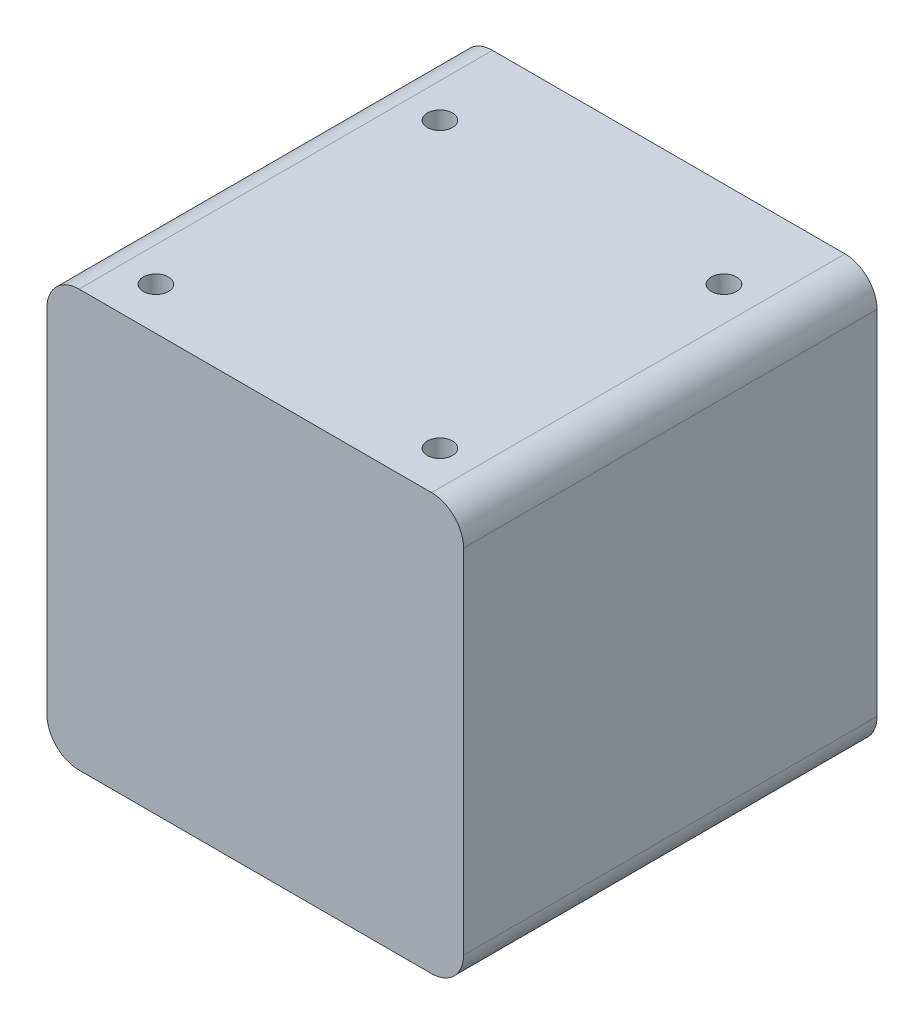
ISO-10303-21;
HEADER;
FILE_DESCRIPTION(('STEP AP214'),'2;1');
FILE_NAME('part.step','',(''),(''),'','','');
FILE_SCHEMA(('AUTOMOTIVE_DESIGN { 1 0 10303 214 1 1 1 1 }'));
ENDSEC;
DATA;
#1=APPLICATION_CONTEXT('core data for automotive mechanical design processes');
#2=APPLICATION_PROTOCOL_DEFINITION('international standard','automotive_design',2000,#1);
#3=PRODUCT_CONTEXT('',#1,'mechanical');
#4=PRODUCT('Part','Part','',(#3));
#5=PRODUCT_RELATED_PRODUCT_CATEGORY('part','',(#4));
#6=PRODUCT_DEFINITION_FORMATION('','',#4);
#7=PRODUCT_DEFINITION_CONTEXT('part definition',#1,'design');
#8=PRODUCT_DEFINITION('design','',#6,#7);
#9=PRODUCT_DEFINITION_SHAPE('','',#8);
#10=(LENGTH_UNIT() NAMED_UNIT(*) SI_UNIT(.MILLI.,.METRE.));
#11=(NAMED_UNIT(*) PLANE_ANGLE_UNIT() SI_UNIT($,.RADIAN.));
#12=(NAMED_UNIT(*) SI_UNIT($,.STERADIAN.) SOLID_ANGLE_UNIT());
#13=UNCERTAINTY_MEASURE_WITH_UNIT(LENGTH_MEASURE(1.E-05),#10,'distance_accuracy_value','');
#14=(GEOMETRIC_REPRESENTATION_CONTEXT(3) GLOBAL_UNCERTAINTY_ASSIGNED_CONTEXT((#13)) GLOBAL_UNIT_ASSIGNED_CONTEXT((#10,
#11,#12)) REPRESENTATION_CONTEXT('',''));
#15=CARTESIAN_POINT('',(0.,0.,0.));
#16=DIRECTION('',(0.,0.,1.));
#17=DIRECTION('',(1.,0.,0.));
#18=AXIS2_PLACEMENT_3D('',#15,#16,#17);
#19=CARTESIAN_POINT('',(-13.2,13.2,26.2));
#20=DIRECTION('',(1.,0.,0.));
#21=DIRECTION('',(0.,1.,0.));
#22=AXIS2_PLACEMENT_3D('',#19,#20,#21);
#23=PLANE('',#22);
#24=DIRECTION('',(0.,-1.,0.));
#25=VECTOR('',#24,1.);
#26=CARTESIAN_POINT('',(-13.2,13.2,0.));
#27=LINE('',#26,#25);
#28=CARTESIAN_POINT('',(-13.2,11.168,0.));
#29=VERTEX_POINT('',#28);
#30=CARTESIAN_POINT('',(-13.2,-11.168,0.));
#31=VERTEX_POINT('',#30);
#32=EDGE_CURVE('E131',#29,#31,#27,.T.);
#33=ORIENTED_EDGE('',*,*,#32,.T.);
#34=DIRECTION('',(0.,0.,-1.));
#35=VECTOR('',#34,1.);
#36=CARTESIAN_POINT('',(-13.2,-11.168,26.2));
#37=LINE('',#36,#35);
#38=CARTESIAN_POINT('',(-13.2,-11.168,26.2));
#39=VERTEX_POINT('',#38);
#40=EDGE_CURVE('E154',#31,#39,#37,.F.);
#41=ORIENTED_EDGE('',*,*,#40,.T.);
#42=DIRECTION('',(0.,-1.,0.));
#43=VECTOR('',#42,1.);
#44=CARTESIAN_POINT('',(-13.2,13.2,26.2));
#45=LINE('',#44,#43);
#46=CARTESIAN_POINT('',(-13.2,11.168,26.2));
#47=VERTEX_POINT('',#46);
#48=EDGE_CURVE('E129',#47,#39,#45,.T.);
#49=ORIENTED_EDGE('',*,*,#48,.F.);
#50=DIRECTION('',(0.,0.,-1.));
#51=VECTOR('',#50,1.);
#52=CARTESIAN_POINT('',(-13.2,11.168,26.2));
#53=LINE('',#52,#51);
#54=EDGE_CURVE('E151',#47,#29,#53,.T.);
#55=ORIENTED_EDGE('',*,*,#54,.T.);
#56=EDGE_LOOP('',(#33,#41,#49,#55));
#57=FACE_BOUND('',#56,.T.);
#58=ADVANCED_FACE('F36',(#57),#23,.F.);
#59=CARTESIAN_POINT('',(13.2,-13.2,26.2));
#60=DIRECTION('',(0.,1.,0.));
#61=DIRECTION('',(-1.,0.,0.));
#62=AXIS2_PLACEMENT_3D('',#59,#60,#61);
#63=PLANE('',#62);
#64=CARTESIAN_POINT('',(-9.,-13.2,23.5));
#65=DIRECTION('',(0.,-1.,0.));
#66=DIRECTION('',(0.,0.,-1.));
#67=AXIS2_PLACEMENT_3D('',#64,#65,#66);
#68=CIRCLE('',#67,0.799999999999999);
#69=CARTESIAN_POINT('',(-9.,-13.2,22.7));
#70=VERTEX_POINT('',#69);
#71=EDGE_CURVE('E206',#70,#70,#68,.T.);
#72=ORIENTED_EDGE('',*,*,#71,.F.);
#73=EDGE_LOOP('',(#72));
#74=FACE_BOUND('',#73,.T.);
#75=CARTESIAN_POINT('',(-9.,-13.2,5.5));
#76=DIRECTION('',(0.,-1.,0.));
#77=DIRECTION('',(0.,0.,-1.));
#78=AXIS2_PLACEMENT_3D('',#75,#76,#77);
#79=CIRCLE('',#78,0.799999999999999);
#80=CARTESIAN_POINT('',(-9.,-13.2,4.7));
#81=VERTEX_POINT('',#80);
#82=EDGE_CURVE('E200',#81,#81,#79,.T.);
#83=ORIENTED_EDGE('',*,*,#82,.F.);
#84=EDGE_LOOP('',(#83));
#85=FACE_BOUND('',#84,.T.);
#86=CARTESIAN_POINT('',(9.00000000000001,-13.2,5.5));
#87=DIRECTION('',(0.,-1.,0.));
#88=DIRECTION('',(0.,0.,-1.));
#89=AXIS2_PLACEMENT_3D('',#86,#87,#88);
#90=CIRCLE('',#89,0.799999999999999);
#91=CARTESIAN_POINT('',(9.00000000000001,-13.2,4.7));
#92=VERTEX_POINT('',#91);
#93=EDGE_CURVE('E194',#92,#92,#90,.T.);
#94=ORIENTED_EDGE('',*,*,#93,.F.);
#95=EDGE_LOOP('',(#94));
#96=FACE_BOUND('',#95,.T.);
#97=CARTESIAN_POINT('',(9.,-13.2,23.5));
#98=DIRECTION('',(0.,-1.,0.));
#99=DIRECTION('',(0.,0.,-1.));
#100=AXIS2_PLACEMENT_3D('',#97,#98,#99);
#101=CIRCLE('',#100,0.799999999999999);
#102=CARTESIAN_POINT('',(9.,-13.2,22.7));
#103=VERTEX_POINT('',#102);
#104=EDGE_CURVE('E188',#103,#103,#101,.T.);
#105=ORIENTED_EDGE('',*,*,#104,.F.);
#106=EDGE_LOOP('',(#105));
#107=FACE_BOUND('',#106,.T.);
#108=DIRECTION('',(1.,0.,0.));
#109=VECTOR('',#108,1.);
#110=CARTESIAN_POINT('',(13.2,-13.2,0.));
#111=LINE('',#110,#109);
#112=CARTESIAN_POINT('',(-11.168,-13.2,0.));
#113=VERTEX_POINT('',#112);
#114=CARTESIAN_POINT('',(11.168,-13.2,0.));
#115=VERTEX_POINT('',#114);
#116=EDGE_CURVE('E127',#113,#115,#111,.T.);
#117=ORIENTED_EDGE('',*,*,#116,.T.);
#118=DIRECTION('',(0.,0.,-1.));
#119=VECTOR('',#118,1.);
#120=CARTESIAN_POINT('',(11.168,-13.2,26.2));
#121=LINE('',#120,#119);
#122=CARTESIAN_POINT('',(11.168,-13.2,26.2));
#123=VERTEX_POINT('',#122);
#124=EDGE_CURVE('E106',#115,#123,#121,.F.);
#125=ORIENTED_EDGE('',*,*,#124,.T.);
#126=DIRECTION('',(1.,0.,0.));
#127=VECTOR('',#126,1.);
#128=CARTESIAN_POINT('',(13.2,-13.2,26.2));
#129=LINE('',#128,#127);
#130=CARTESIAN_POINT('',(-11.168,-13.2,26.2));
#131=VERTEX_POINT('',#130);
#132=EDGE_CURVE('E170',#131,#123,#129,.T.);
#133=ORIENTED_EDGE('',*,*,#132,.F.);
#134=DIRECTION('',(0.,0.,-1.));
#135=VECTOR('',#134,1.);
#136=CARTESIAN_POINT('',(-11.168,-13.2,26.2));
#137=LINE('',#136,#135);
#138=EDGE_CURVE('E111',#131,#113,#137,.T.);
#139=ORIENTED_EDGE('',*,*,#138,.T.);
#140=EDGE_LOOP('',(#117,#125,#133,#139));
#141=FACE_BOUND('',#140,.T.);
#142=ADVANCED_FACE('F264',(#74,#85,#96,#107,#141),#63,.F.);
#143=CARTESIAN_POINT('',(13.2,13.2,26.2));
#144=DIRECTION('',(-1.,0.,0.));
#145=DIRECTION('',(0.,-1.,0.));
#146=AXIS2_PLACEMENT_3D('',#143,#144,#145);
#147=PLANE('',#146);
#148=DIRECTION('',(0.,1.,0.));
#149=VECTOR('',#148,1.);
#150=CARTESIAN_POINT('',(13.2,13.2,26.2));
#151=LINE('',#150,#149);
#152=CARTESIAN_POINT('',(13.2,-11.168,26.2));
#153=VERTEX_POINT('',#152);
#154=CARTESIAN_POINT('',(13.2,11.168,26.2));
#155=VERTEX_POINT('',#154);
#156=EDGE_CURVE('E120',#153,#155,#151,.T.);
#157=ORIENTED_EDGE('',*,*,#156,.F.);
#158=DIRECTION('',(0.,0.,-1.));
#159=VECTOR('',#158,1.);
#160=CARTESIAN_POINT('',(13.2,-11.168,26.2));
#161=LINE('',#160,#159);
#162=CARTESIAN_POINT('',(13.2,-11.168,0.));
#163=VERTEX_POINT('',#162);
#164=EDGE_CURVE('E105',#153,#163,#161,.T.);
#165=ORIENTED_EDGE('',*,*,#164,.T.);
#166=DIRECTION('',(0.,1.,0.));
#167=VECTOR('',#166,1.);
#168=CARTESIAN_POINT('',(13.2,13.2,0.));
#169=LINE('',#168,#167);
#170=CARTESIAN_POINT('',(13.2,11.168,0.));
#171=VERTEX_POINT('',#170);
#172=EDGE_CURVE('E118',#163,#171,#169,.T.);
#173=ORIENTED_EDGE('',*,*,#172,.T.);
#174=DIRECTION('',(0.,0.,-1.));
#175=VECTOR('',#174,1.);
#176=CARTESIAN_POINT('',(13.2,11.168,26.2));
#177=LINE('',#176,#175);
#178=EDGE_CURVE('E122',#171,#155,#177,.F.);
#179=ORIENTED_EDGE('',*,*,#178,.T.);
#180=EDGE_LOOP('',(#157,#165,#173,#179));
#181=FACE_BOUND('',#180,.T.);
#182=ADVANCED_FACE('F117',(#181),#147,.F.);
#183=CARTESIAN_POINT('',(13.2,13.2,26.2));
#184=DIRECTION('',(0.,-1.,0.));
#185=DIRECTION('',(1.,0.,0.));
#186=AXIS2_PLACEMENT_3D('',#183,#184,#185);
#187=PLANE('',#186);
#188=CARTESIAN_POINT('',(9.,13.2,5.5));
#189=DIRECTION('',(0.,1.,0.));
#190=DIRECTION('',(0.,0.,1.));
#191=AXIS2_PLACEMENT_3D('',#188,#189,#190);
#192=CIRCLE('',#191,0.79999999999999);
#193=CARTESIAN_POINT('',(9.,13.2,6.29999999999999));
#194=VERTEX_POINT('',#193);
#195=EDGE_CURVE('E230',#194,#194,#192,.T.);
#196=ORIENTED_EDGE('',*,*,#195,.F.);
#197=EDGE_LOOP('',(#196));
#198=FACE_BOUND('',#197,.T.);
#199=CARTESIAN_POINT('',(9.,13.2,23.5));
#200=DIRECTION('',(0.,1.,0.));
#201=DIRECTION('',(0.,0.,1.));
#202=AXIS2_PLACEMENT_3D('',#199,#200,#201);
#203=CIRCLE('',#202,0.79999999999999);
#204=CARTESIAN_POINT('',(9.,13.2,24.3));
#205=VERTEX_POINT('',#204);
#206=EDGE_CURVE('E224',#205,#205,#203,.T.);
#207=ORIENTED_EDGE('',*,*,#206,.F.);
#208=EDGE_LOOP('',(#207));
#209=FACE_BOUND('',#208,.T.);
#210=CARTESIAN_POINT('',(-9.,13.2,23.5));
#211=DIRECTION('',(0.,1.,0.));
#212=DIRECTION('',(0.,0.,1.));
#213=AXIS2_PLACEMENT_3D('',#210,#211,#212);
#214=CIRCLE('',#213,0.79999999999999);
#215=CARTESIAN_POINT('',(-9.,13.2,24.3));
#216=VERTEX_POINT('',#215);
#217=EDGE_CURVE('E218',#216,#216,#214,.T.);
#218=ORIENTED_EDGE('',*,*,#217,.F.);
#219=EDGE_LOOP('',(#218));
#220=FACE_BOUND('',#219,.T.);
#221=CARTESIAN_POINT('',(-9.,13.2,5.5));
#222=DIRECTION('',(0.,1.,0.));
#223=DIRECTION('',(0.,0.,1.));
#224=AXIS2_PLACEMENT_3D('',#221,#222,#223);
#225=CIRCLE('',#224,0.79999999999999);
#226=CARTESIAN_POINT('',(-9.,13.2,6.29999999999999));
#227=VERTEX_POINT('',#226);
#228=EDGE_CURVE('E212',#227,#227,#225,.T.);
#229=ORIENTED_EDGE('',*,*,#228,.F.);
#230=EDGE_LOOP('',(#229));
#231=FACE_BOUND('',#230,.T.);
#232=DIRECTION('',(-1.,0.,0.));
#233=VECTOR('',#232,1.);
#234=CARTESIAN_POINT('',(13.2,13.2,0.));
#235=LINE('',#234,#233);
#236=CARTESIAN_POINT('',(11.168,13.2,0.));
#237=VERTEX_POINT('',#236);
#238=CARTESIAN_POINT('',(-11.168,13.2,0.));
#239=VERTEX_POINT('',#238);
#240=EDGE_CURVE('E126',#237,#239,#235,.T.);
#241=ORIENTED_EDGE('',*,*,#240,.T.);
#242=DIRECTION('',(0.,0.,-1.));
#243=VECTOR('',#242,1.);
#244=CARTESIAN_POINT('',(-11.168,13.2,26.2));
#245=LINE('',#244,#243);
#246=CARTESIAN_POINT('',(-11.168,13.2,26.2));
#247=VERTEX_POINT('',#246);
#248=EDGE_CURVE('E11',#239,#247,#245,.F.);
#249=ORIENTED_EDGE('',*,*,#248,.T.);
#250=DIRECTION('',(-1.,0.,0.));
#251=VECTOR('',#250,1.);
#252=CARTESIAN_POINT('',(13.2,13.2,26.2));
#253=LINE('',#252,#251);
#254=CARTESIAN_POINT('',(11.168,13.2,26.2));
#255=VERTEX_POINT('',#254);
#256=EDGE_CURVE('E135',#255,#247,#253,.T.);
#257=ORIENTED_EDGE('',*,*,#256,.F.);
#258=DIRECTION('',(0.,0.,-1.));
#259=VECTOR('',#258,1.);
#260=CARTESIAN_POINT('',(11.168,13.2,26.2));
#261=LINE('',#260,#259);
#262=EDGE_CURVE('E44',#255,#237,#261,.T.);
#263=ORIENTED_EDGE('',*,*,#262,.T.);
#264=EDGE_LOOP('',(#241,#249,#257,#263));
#265=FACE_BOUND('',#264,.T.);
#266=ADVANCED_FACE('F157',(#198,#209,#220,#231,#265),#187,.F.);
#267=CARTESIAN_POINT('',(0.,0.,26.2));
#268=DIRECTION('',(0.,0.,-1.));
#269=DIRECTION('',(-1.,0.,0.));
#270=AXIS2_PLACEMENT_3D('',#267,#268,#269);
#271=PLANE('',#270);
#272=ORIENTED_EDGE('',*,*,#132,.T.);
#273=CARTESIAN_POINT('',(11.168,-11.168,26.2));
#274=DIRECTION('',(0.,0.,-1.));
#275=DIRECTION('',(-1.,0.,0.));
#276=AXIS2_PLACEMENT_3D('',#273,#274,#275);
#277=CIRCLE('',#276,2.032);
#278=EDGE_CURVE('E149',#123,#153,#277,.F.);
#279=ORIENTED_EDGE('',*,*,#278,.T.);
#280=ORIENTED_EDGE('',*,*,#156,.T.);
#281=CARTESIAN_POINT('',(11.168,11.168,26.2));
#282=DIRECTION('',(0.,0.,-1.));
#283=DIRECTION('',(-1.,0.,0.));
#284=AXIS2_PLACEMENT_3D('',#281,#282,#283);
#285=CIRCLE('',#284,2.032);
#286=EDGE_CURVE('E56',#155,#255,#285,.F.);
#287=ORIENTED_EDGE('',*,*,#286,.T.);
#288=ORIENTED_EDGE('',*,*,#256,.T.);
#289=CARTESIAN_POINT('',(-11.168,11.168,26.2));
#290=DIRECTION('',(0.,0.,-1.));
#291=DIRECTION('',(-1.,0.,0.));
#292=AXIS2_PLACEMENT_3D('',#289,#290,#291);
#293=CIRCLE('',#292,2.032);
#294=EDGE_CURVE('E145',#247,#47,#293,.F.);
#295=ORIENTED_EDGE('',*,*,#294,.T.);
#296=ORIENTED_EDGE('',*,*,#48,.T.);
#297=CARTESIAN_POINT('',(-11.168,-11.168,26.2));
#298=DIRECTION('',(0.,0.,-1.));
#299=DIRECTION('',(-1.,0.,0.));
#300=AXIS2_PLACEMENT_3D('',#297,#298,#299);
#301=CIRCLE('',#300,2.032);
#302=EDGE_CURVE('E147',#39,#131,#301,.F.);
#303=ORIENTED_EDGE('',*,*,#302,.T.);
#304=EDGE_LOOP('',(#272,#279,#280,#287,#288,#295,#296,#303));
#305=FACE_BOUND('',#304,.T.);
#306=ADVANCED_FACE('F238',(#305),#271,.F.);
#307=CARTESIAN_POINT('',(0.,0.,0.));
#308=DIRECTION('',(0.,0.,-1.));
#309=DIRECTION('',(-1.,0.,0.));
#310=AXIS2_PLACEMENT_3D('',#307,#308,#309);
#311=PLANE('',#310);
#312=CARTESIAN_POINT('',(0.,0.,0.));
#313=DIRECTION('',(0.,0.,-1.));
#314=DIRECTION('',(-1.,0.,0.));
#315=AXIS2_PLACEMENT_3D('',#312,#313,#314);
#316=CIRCLE('',#315,12.6261921591022);
#317=CARTESIAN_POINT('',(-12.6261921591022,0.,0.));
#318=VERTEX_POINT('',#317);
#319=EDGE_CURVE('E175',#318,#318,#316,.T.);
#320=ORIENTED_EDGE('',*,*,#319,.F.);
#321=EDGE_LOOP('',(#320));
#322=FACE_BOUND('',#321,.T.);
#323=ORIENTED_EDGE('',*,*,#172,.F.);
#324=CARTESIAN_POINT('',(11.168,-11.168,0.));
#325=DIRECTION('',(0.,0.,-1.));
#326=DIRECTION('',(-1.,0.,0.));
#327=AXIS2_PLACEMENT_3D('',#324,#325,#326);
#328=CIRCLE('',#327,2.032);
#329=EDGE_CURVE('E101',#163,#115,#328,.T.);
#330=ORIENTED_EDGE('',*,*,#329,.T.);
#331=ORIENTED_EDGE('',*,*,#116,.F.);
#332=CARTESIAN_POINT('',(-11.168,-11.168,0.));
#333=DIRECTION('',(0.,0.,-1.));
#334=DIRECTION('',(-1.,0.,0.));
#335=AXIS2_PLACEMENT_3D('',#332,#333,#334);
#336=CIRCLE('',#335,2.032);
#337=EDGE_CURVE('E112',#113,#31,#336,.T.);
#338=ORIENTED_EDGE('',*,*,#337,.T.);
#339=ORIENTED_EDGE('',*,*,#32,.F.);
#340=CARTESIAN_POINT('',(-11.168,11.168,0.));
#341=DIRECTION('',(0.,0.,-1.));
#342=DIRECTION('',(-1.,0.,0.));
#343=AXIS2_PLACEMENT_3D('',#340,#341,#342);
#344=CIRCLE('',#343,2.032);
#345=EDGE_CURVE('E138',#29,#239,#344,.T.);
#346=ORIENTED_EDGE('',*,*,#345,.T.);
#347=ORIENTED_EDGE('',*,*,#240,.F.);
#348=CARTESIAN_POINT('',(11.168,11.168,0.));
#349=DIRECTION('',(0.,0.,-1.));
#350=DIRECTION('',(-1.,0.,0.));
#351=AXIS2_PLACEMENT_3D('',#348,#349,#350);
#352=CIRCLE('',#351,2.032);
#353=EDGE_CURVE('E121',#237,#171,#352,.T.);
#354=ORIENTED_EDGE('',*,*,#353,.T.);
#355=EDGE_LOOP('',(#323,#330,#331,#338,#339,#346,#347,#354));
#356=FACE_BOUND('',#355,.T.);
#357=ADVANCED_FACE('F124',(#322,#356),#311,.T.);
#358=CARTESIAN_POINT('',(11.168,-11.168,26.2));
#359=DIRECTION('',(0.,0.,-1.));
#360=DIRECTION('',(-1.,0.,0.));
#361=AXIS2_PLACEMENT_3D('',#358,#359,#360);
#362=CYLINDRICAL_SURFACE('',#361,2.032);
#363=ORIENTED_EDGE('',*,*,#278,.F.);
#364=ORIENTED_EDGE('',*,*,#124,.F.);
#365=ORIENTED_EDGE('',*,*,#329,.F.);
#366=ORIENTED_EDGE('',*,*,#164,.F.);
#367=EDGE_LOOP('',(#363,#364,#365,#366));
#368=FACE_BOUND('',#367,.T.);
#369=ADVANCED_FACE('F104',(#368),#362,.T.);
#370=CARTESIAN_POINT('',(-11.168,-11.168,26.2));
#371=DIRECTION('',(0.,0.,-1.));
#372=DIRECTION('',(-1.,0.,0.));
#373=AXIS2_PLACEMENT_3D('',#370,#371,#372);
#374=CYLINDRICAL_SURFACE('',#373,2.032);
#375=ORIENTED_EDGE('',*,*,#302,.F.);
#376=ORIENTED_EDGE('',*,*,#40,.F.);
#377=ORIENTED_EDGE('',*,*,#337,.F.);
#378=ORIENTED_EDGE('',*,*,#138,.F.);
#379=EDGE_LOOP('',(#375,#376,#377,#378));
#380=FACE_BOUND('',#379,.T.);
#381=ADVANCED_FACE('F275',(#380),#374,.T.);
#382=CARTESIAN_POINT('',(-11.168,11.168,26.2));
#383=DIRECTION('',(0.,0.,-1.));
#384=DIRECTION('',(-1.,0.,0.));
#385=AXIS2_PLACEMENT_3D('',#382,#383,#384);
#386=CYLINDRICAL_SURFACE('',#385,2.032);
#387=ORIENTED_EDGE('',*,*,#294,.F.);
#388=ORIENTED_EDGE('',*,*,#248,.F.);
#389=ORIENTED_EDGE('',*,*,#345,.F.);
#390=ORIENTED_EDGE('',*,*,#54,.F.);
#391=EDGE_LOOP('',(#387,#388,#389,#390));
#392=FACE_BOUND('',#391,.T.);
#393=ADVANCED_FACE('F164',(#392),#386,.T.);
#394=CARTESIAN_POINT('',(11.168,11.168,26.2));
#395=DIRECTION('',(0.,0.,-1.));
#396=DIRECTION('',(-1.,0.,0.));
#397=AXIS2_PLACEMENT_3D('',#394,#395,#396);
#398=CYLINDRICAL_SURFACE('',#397,2.032);
#399=ORIENTED_EDGE('',*,*,#286,.F.);
#400=ORIENTED_EDGE('',*,*,#178,.F.);
#401=ORIENTED_EDGE('',*,*,#353,.F.);
#402=ORIENTED_EDGE('',*,*,#262,.F.);
#403=EDGE_LOOP('',(#399,#400,#401,#402));
#404=FACE_BOUND('',#403,.T.);
#405=ADVANCED_FACE('F38',(#404),#398,.T.);
#406=CARTESIAN_POINT('',(0.,0.,2.5));
#407=DIRECTION('',(0.,0.,-1.));
#408=DIRECTION('',(-1.,0.,0.));
#409=AXIS2_PLACEMENT_3D('',#406,#407,#408);
#410=CYLINDRICAL_SURFACE('',#409,12.6261921591022);
#411=CARTESIAN_POINT('',(0.,0.,2.5));
#412=DIRECTION('',(0.,0.,-1.));
#413=DIRECTION('',(-1.,0.,0.));
#414=AXIS2_PLACEMENT_3D('',#411,#412,#413);
#415=CIRCLE('',#414,12.6261921591022);
#416=CARTESIAN_POINT('',(-12.6261921591022,0.,2.5));
#417=VERTEX_POINT('',#416);
#418=EDGE_CURVE('E179',#417,#417,#415,.T.);
#419=ORIENTED_EDGE('',*,*,#418,.F.);
#420=EDGE_LOOP('',(#419));
#421=FACE_BOUND('',#420,.T.);
#422=ORIENTED_EDGE('',*,*,#319,.T.);
#423=EDGE_LOOP('',(#422));
#424=FACE_BOUND('',#423,.T.);
#425=ADVANCED_FACE('F282',(#421,#424),#410,.F.);
#426=CARTESIAN_POINT('',(0.,0.,2.5));
#427=DIRECTION('',(0.,0.,-1.));
#428=DIRECTION('',(-1.,0.,0.));
#429=AXIS2_PLACEMENT_3D('',#426,#427,#428);
#430=PLANE('',#429);
#431=ORIENTED_EDGE('',*,*,#418,.T.);
#432=EDGE_LOOP('',(#431));
#433=FACE_BOUND('',#432,.T.);
#434=ADVANCED_FACE('F286',(#433),#430,.T.);
#435=CARTESIAN_POINT('',(9.,-7.86599999999999,23.5));
#436=DIRECTION('',(0.,1.,0.));
#437=DIRECTION('',(0.,0.,1.));
#438=AXIS2_PLACEMENT_3D('',#435,#436,#437);
#439=PLANE('',#438);
#440=CARTESIAN_POINT('',(9.,-7.86599999999999,23.5));
#441=DIRECTION('',(0.,-1.,0.));
#442=DIRECTION('',(0.,0.,-1.));
#443=AXIS2_PLACEMENT_3D('',#440,#441,#442);
#444=CIRCLE('',#443,0.799999999999999);
#445=CARTESIAN_POINT('',(9.,-7.86599999999999,22.7));
#446=VERTEX_POINT('',#445);
#447=EDGE_CURVE('E184',#446,#446,#444,.T.);
#448=ORIENTED_EDGE('',*,*,#447,.T.);
#449=EDGE_LOOP('',(#448));
#450=FACE_BOUND('',#449,.T.);
#451=ADVANCED_FACE('F437',(#450),#439,.F.);
#452=CARTESIAN_POINT('',(9.,-13.2,23.5));
#453=DIRECTION('',(0.,-1.,0.));
#454=DIRECTION('',(0.,0.,-1.));
#455=AXIS2_PLACEMENT_3D('',#452,#453,#454);
#456=CYLINDRICAL_SURFACE('',#455,0.799999999999999);
#457=ORIENTED_EDGE('',*,*,#447,.F.);
#458=EDGE_LOOP('',(#457));
#459=FACE_BOUND('',#458,.T.);
#460=ORIENTED_EDGE('',*,*,#104,.T.);
#461=EDGE_LOOP('',(#460));
#462=FACE_BOUND('',#461,.T.);
#463=ADVANCED_FACE('F434',(#459,#462),#456,.F.);
#464=CARTESIAN_POINT('',(9.,-7.86599999999999,5.5));
#465=DIRECTION('',(0.,1.,0.));
#466=DIRECTION('',(0.,0.,1.));
#467=AXIS2_PLACEMENT_3D('',#464,#465,#466);
#468=PLANE('',#467);
#469=CARTESIAN_POINT('',(9.00000000000001,-7.86599999999999,5.5));
#470=DIRECTION('',(0.,-1.,0.));
#471=DIRECTION('',(0.,0.,-1.));
#472=AXIS2_PLACEMENT_3D('',#469,#470,#471);
#473=CIRCLE('',#472,0.799999999999999);
#474=CARTESIAN_POINT('',(9.00000000000001,-7.86599999999999,4.7));
#475=VERTEX_POINT('',#474);
#476=EDGE_CURVE('E191',#475,#475,#473,.T.);
#477=ORIENTED_EDGE('',*,*,#476,.T.);
#478=EDGE_LOOP('',(#477));
#479=FACE_BOUND('',#478,.T.);
#480=ADVANCED_FACE('F426',(#479),#468,.F.);
#481=CARTESIAN_POINT('',(9.00000000000001,-13.2,5.5));
#482=DIRECTION('',(0.,-1.,0.));
#483=DIRECTION('',(0.,0.,-1.));
#484=AXIS2_PLACEMENT_3D('',#481,#482,#483);
#485=CYLINDRICAL_SURFACE('',#484,0.799999999999999);
#486=ORIENTED_EDGE('',*,*,#476,.F.);
#487=EDGE_LOOP('',(#486));
#488=FACE_BOUND('',#487,.T.);
#489=ORIENTED_EDGE('',*,*,#93,.T.);
#490=EDGE_LOOP('',(#489));
#491=FACE_BOUND('',#490,.T.);
#492=ADVANCED_FACE('F422',(#488,#491),#485,.F.);
#493=CARTESIAN_POINT('',(-9.,-7.866,5.5));
#494=DIRECTION('',(0.,1.,0.));
#495=DIRECTION('',(0.,0.,1.));
#496=AXIS2_PLACEMENT_3D('',#493,#494,#495);
#497=PLANE('',#496);
#498=CARTESIAN_POINT('',(-9.,-7.866,5.5));
#499=DIRECTION('',(0.,-1.,0.));
#500=DIRECTION('',(0.,0.,-1.));
#501=AXIS2_PLACEMENT_3D('',#498,#499,#500);
#502=CIRCLE('',#501,0.799999999999999);
#503=CARTESIAN_POINT('',(-9.,-7.866,4.7));
#504=VERTEX_POINT('',#503);
#505=EDGE_CURVE('E197',#504,#504,#502,.T.);
#506=ORIENTED_EDGE('',*,*,#505,.T.);
#507=EDGE_LOOP('',(#506));
#508=FACE_BOUND('',#507,.T.);
#509=ADVANCED_FACE('F414',(#508),#497,.F.);
#510=CARTESIAN_POINT('',(-9.,-13.2,5.5));
#511=DIRECTION('',(0.,-1.,0.));
#512=DIRECTION('',(0.,0.,-1.));
#513=AXIS2_PLACEMENT_3D('',#510,#511,#512);
#514=CYLINDRICAL_SURFACE('',#513,0.799999999999999);
#515=ORIENTED_EDGE('',*,*,#505,.F.);
#516=EDGE_LOOP('',(#515));
#517=FACE_BOUND('',#516,.T.);
#518=ORIENTED_EDGE('',*,*,#82,.T.);
#519=EDGE_LOOP('',(#518));
#520=FACE_BOUND('',#519,.T.);
#521=ADVANCED_FACE('F410',(#517,#520),#514,.F.);
#522=CARTESIAN_POINT('',(-9.,-7.866,23.5));
#523=DIRECTION('',(0.,1.,0.));
#524=DIRECTION('',(0.,0.,1.));
#525=AXIS2_PLACEMENT_3D('',#522,#523,#524);
#526=PLANE('',#525);
#527=CARTESIAN_POINT('',(-9.,-7.866,23.5));
#528=DIRECTION('',(0.,-1.,0.));
#529=DIRECTION('',(0.,0.,-1.));
#530=AXIS2_PLACEMENT_3D('',#527,#528,#529);
#531=CIRCLE('',#530,0.799999999999999);
#532=CARTESIAN_POINT('',(-9.,-7.866,22.7));
#533=VERTEX_POINT('',#532);
#534=EDGE_CURVE('E203',#533,#533,#531,.T.);
#535=ORIENTED_EDGE('',*,*,#534,.T.);
#536=EDGE_LOOP('',(#535));
#537=FACE_BOUND('',#536,.T.);
#538=ADVANCED_FACE('F403',(#537),#526,.F.);
#539=CARTESIAN_POINT('',(-9.,-13.2,23.5));
#540=DIRECTION('',(0.,-1.,0.));
#541=DIRECTION('',(0.,0.,-1.));
#542=AXIS2_PLACEMENT_3D('',#539,#540,#541);
#543=CYLINDRICAL_SURFACE('',#542,0.799999999999999);
#544=ORIENTED_EDGE('',*,*,#534,.F.);
#545=EDGE_LOOP('',(#544));
#546=FACE_BOUND('',#545,.T.);
#547=ORIENTED_EDGE('',*,*,#71,.T.);
#548=EDGE_LOOP('',(#547));
#549=FACE_BOUND('',#548,.T.);
#550=ADVANCED_FACE('F259',(#546,#549),#543,.F.);
#551=CARTESIAN_POINT('',(-9.,7.866,5.5));
#552=DIRECTION('',(0.,-1.,0.));
#553=DIRECTION('',(0.,0.,-1.));
#554=AXIS2_PLACEMENT_3D('',#551,#552,#553);
#555=PLANE('',#554);
#556=CARTESIAN_POINT('',(-9.,7.86600000000001,5.5));
#557=DIRECTION('',(0.,1.,0.));
#558=DIRECTION('',(0.,0.,1.));
#559=AXIS2_PLACEMENT_3D('',#556,#557,#558);
#560=CIRCLE('',#559,0.799999999999988);
#561=CARTESIAN_POINT('',(-9.,7.86600000000001,6.29999999999999));
#562=VERTEX_POINT('',#561);
#563=EDGE_CURVE('E209',#562,#562,#560,.T.);
#564=ORIENTED_EDGE('',*,*,#563,.T.);
#565=EDGE_LOOP('',(#564));
#566=FACE_BOUND('',#565,.T.);
#567=ADVANCED_FACE('F249',(#566),#555,.F.);
#568=CARTESIAN_POINT('',(-9.,13.2,5.5));
#569=DIRECTION('',(0.,1.,0.));
#570=DIRECTION('',(0.,0.,1.));
#571=AXIS2_PLACEMENT_3D('',#568,#569,#570);
#572=CYLINDRICAL_SURFACE('',#571,0.799999999999989);
#573=ORIENTED_EDGE('',*,*,#563,.F.);
#574=EDGE_LOOP('',(#573));
#575=FACE_BOUND('',#574,.T.);
#576=ORIENTED_EDGE('',*,*,#228,.T.);
#577=EDGE_LOOP('',(#576));
#578=FACE_BOUND('',#577,.T.);
#579=ADVANCED_FACE('F246',(#575,#578),#572,.F.);
#580=CARTESIAN_POINT('',(-9.,7.866,23.5));
#581=DIRECTION('',(0.,-1.,0.));
#582=DIRECTION('',(0.,0.,-1.));
#583=AXIS2_PLACEMENT_3D('',#580,#581,#582);
#584=PLANE('',#583);
#585=CARTESIAN_POINT('',(-9.,7.86600000000001,23.5));
#586=DIRECTION('',(0.,1.,0.));
#587=DIRECTION('',(0.,0.,1.));
#588=AXIS2_PLACEMENT_3D('',#585,#586,#587);
#589=CIRCLE('',#588,0.799999999999988);
#590=CARTESIAN_POINT('',(-9.,7.86600000000001,24.3));
#591=VERTEX_POINT('',#590);
#592=EDGE_CURVE('E215',#591,#591,#589,.T.);
#593=ORIENTED_EDGE('',*,*,#592,.T.);
#594=EDGE_LOOP('',(#593));
#595=FACE_BOUND('',#594,.T.);
#596=ADVANCED_FACE('F248',(#595),#584,.F.);
#597=CARTESIAN_POINT('',(-9.,13.2,23.5));
#598=DIRECTION('',(0.,1.,0.));
#599=DIRECTION('',(0.,0.,1.));
#600=AXIS2_PLACEMENT_3D('',#597,#598,#599);
#601=CYLINDRICAL_SURFACE('',#600,0.799999999999989);
#602=ORIENTED_EDGE('',*,*,#592,.F.);
#603=EDGE_LOOP('',(#602));
#604=FACE_BOUND('',#603,.T.);
#605=ORIENTED_EDGE('',*,*,#217,.T.);
#606=EDGE_LOOP('',(#605));
#607=FACE_BOUND('',#606,.T.);
#608=ADVANCED_FACE('F256',(#604,#607),#601,.F.);
#609=CARTESIAN_POINT('',(9.,7.866,23.5));
#610=DIRECTION('',(0.,-1.,0.));
#611=DIRECTION('',(0.,0.,-1.));
#612=AXIS2_PLACEMENT_3D('',#609,#610,#611);
#613=PLANE('',#612);
#614=CARTESIAN_POINT('',(9.,7.86600000000001,23.5));
#615=DIRECTION('',(0.,1.,0.));
#616=DIRECTION('',(0.,0.,1.));
#617=AXIS2_PLACEMENT_3D('',#614,#615,#616);
#618=CIRCLE('',#617,0.799999999999988);
#619=CARTESIAN_POINT('',(9.,7.86600000000001,24.3));
#620=VERTEX_POINT('',#619);
#621=EDGE_CURVE('E221',#620,#620,#618,.T.);
#622=ORIENTED_EDGE('',*,*,#621,.T.);
#623=EDGE_LOOP('',(#622));
#624=FACE_BOUND('',#623,.T.);
#625=ADVANCED_FACE('F345',(#624),#613,.F.);
#626=CARTESIAN_POINT('',(9.,13.2,23.5));
#627=DIRECTION('',(0.,1.,0.));
#628=DIRECTION('',(0.,0.,1.));
#629=AXIS2_PLACEMENT_3D('',#626,#627,#628);
#630=CYLINDRICAL_SURFACE('',#629,0.799999999999989);
#631=ORIENTED_EDGE('',*,*,#621,.F.);
#632=EDGE_LOOP('',(#631));
#633=FACE_BOUND('',#632,.T.);
#634=ORIENTED_EDGE('',*,*,#206,.T.);
#635=EDGE_LOOP('',(#634));
#636=FACE_BOUND('',#635,.T.);
#637=ADVANCED_FACE('F357',(#633,#636),#630,.F.);
#638=CARTESIAN_POINT('',(9.,7.866,5.5));
#639=DIRECTION('',(0.,-1.,0.));
#640=DIRECTION('',(0.,0.,-1.));
#641=AXIS2_PLACEMENT_3D('',#638,#639,#640);
#642=PLANE('',#641);
#643=CARTESIAN_POINT('',(9.,7.86600000000001,5.5));
#644=DIRECTION('',(0.,1.,0.));
#645=DIRECTION('',(0.,0.,1.));
#646=AXIS2_PLACEMENT_3D('',#643,#644,#645);
#647=CIRCLE('',#646,0.799999999999988);
#648=CARTESIAN_POINT('',(9.,7.86600000000001,6.29999999999999));
#649=VERTEX_POINT('',#648);
#650=EDGE_CURVE('E227',#649,#649,#647,.T.);
#651=ORIENTED_EDGE('',*,*,#650,.T.);
#652=EDGE_LOOP('',(#651));
#653=FACE_BOUND('',#652,.T.);
#654=ADVANCED_FACE('F367',(#653),#642,.F.);
#655=CARTESIAN_POINT('',(9.,13.2,5.5));
#656=DIRECTION('',(0.,1.,0.));
#657=DIRECTION('',(0.,0.,1.));
#658=AXIS2_PLACEMENT_3D('',#655,#656,#657);
#659=CYLINDRICAL_SURFACE('',#658,0.799999999999989);
#660=ORIENTED_EDGE('',*,*,#650,.F.);
#661=EDGE_LOOP('',(#660));
#662=FACE_BOUND('',#661,.T.);
#663=ORIENTED_EDGE('',*,*,#195,.T.);
#664=EDGE_LOOP('',(#663));
#665=FACE_BOUND('',#664,.T.);
#666=ADVANCED_FACE('F234',(#662,#665),#659,.F.);
#667=CLOSED_SHELL('',(#58,#142,#182,#266,#306,#357,#369,#381,#393,#405,#425,#434,#451,#463,#480,
#492,#509,#521,#538,#550,#567,#579,#596,#608,#625,#637,#654,#666));
#668=MANIFOLD_SOLID_BREP('B2',#667);
#669=ADVANCED_BREP_SHAPE_REPRESENTATION('',(#18,#668),#14);
#670=SHAPE_DEFINITION_REPRESENTATION(#9,#669);
ENDSEC;
END-ISO-10303-21;
